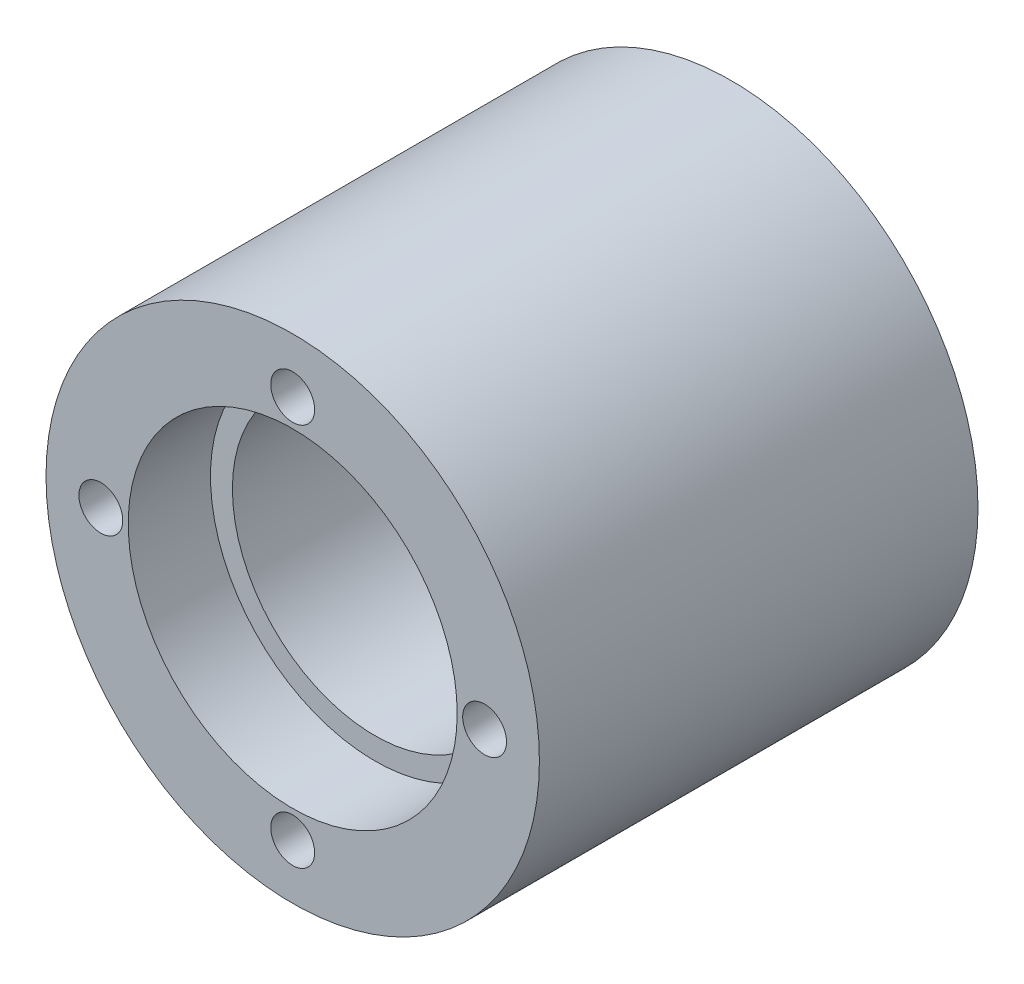
ISO-10303-21;
HEADER;
FILE_DESCRIPTION(('STEP AP214'),'2;1');
FILE_NAME('part.step','',(''),(''),'','','');
FILE_SCHEMA(('AUTOMOTIVE_DESIGN { 1 0 10303 214 1 1 1 1 }'));
ENDSEC;
DATA;
#1=APPLICATION_CONTEXT('core data for automotive mechanical design processes');
#2=APPLICATION_PROTOCOL_DEFINITION('international standard','automotive_design',2000,#1);
#3=PRODUCT_CONTEXT('',#1,'mechanical');
#4=PRODUCT('Part','Part','',(#3));
#5=PRODUCT_RELATED_PRODUCT_CATEGORY('part','',(#4));
#6=PRODUCT_DEFINITION_FORMATION('','',#4);
#7=PRODUCT_DEFINITION_CONTEXT('part definition',#1,'design');
#8=PRODUCT_DEFINITION('design','',#6,#7);
#9=PRODUCT_DEFINITION_SHAPE('','',#8);
#10=(LENGTH_UNIT() NAMED_UNIT(*) SI_UNIT(.MILLI.,.METRE.));
#11=(NAMED_UNIT(*) PLANE_ANGLE_UNIT() SI_UNIT($,.RADIAN.));
#12=(NAMED_UNIT(*) SI_UNIT($,.STERADIAN.) SOLID_ANGLE_UNIT());
#13=UNCERTAINTY_MEASURE_WITH_UNIT(LENGTH_MEASURE(1.E-05),#10,'distance_accuracy_value','');
#14=(GEOMETRIC_REPRESENTATION_CONTEXT(3) GLOBAL_UNCERTAINTY_ASSIGNED_CONTEXT((#13)) GLOBAL_UNIT_ASSIGNED_CONTEXT((#10,
#11,#12)) REPRESENTATION_CONTEXT('',''));
#15=CARTESIAN_POINT('',(0.,0.,0.));
#16=DIRECTION('',(0.,0.,1.));
#17=DIRECTION('',(1.,0.,0.));
#18=AXIS2_PLACEMENT_3D('',#15,#16,#17);
#19=CARTESIAN_POINT('',(0.,0.,-20.));
#20=DIRECTION('',(0.,0.,1.));
#21=DIRECTION('',(-1.,0.,0.));
#22=AXIS2_PLACEMENT_3D('',#19,#20,#21);
#23=CYLINDRICAL_SURFACE('',#22,15.);
#24=CARTESIAN_POINT('',(0.,0.,20.));
#25=DIRECTION('',(0.,0.,1.));
#26=DIRECTION('',(1.,0.,0.));
#27=AXIS2_PLACEMENT_3D('',#24,#25,#26);
#28=CIRCLE('',#27,15.);
#29=CARTESIAN_POINT('',(15.,0.,20.));
#30=VERTEX_POINT('',#29);
#31=EDGE_CURVE('E61',#30,#30,#28,.T.);
#32=ORIENTED_EDGE('',*,*,#31,.T.);
#33=EDGE_LOOP('',(#32));
#34=FACE_BOUND('',#33,.T.);
#35=CARTESIAN_POINT('',(0.,0.,12.5));
#36=DIRECTION('',(0.,0.,1.));
#37=DIRECTION('',(1.,0.,0.));
#38=AXIS2_PLACEMENT_3D('',#35,#36,#37);
#39=CIRCLE('',#38,15.);
#40=CARTESIAN_POINT('',(15.,0.,12.5));
#41=VERTEX_POINT('',#40);
#42=EDGE_CURVE('E88',#41,#41,#39,.T.);
#43=ORIENTED_EDGE('',*,*,#42,.F.);
#44=EDGE_LOOP('',(#43));
#45=FACE_BOUND('',#44,.T.);
#46=ADVANCED_FACE('F43',(#34,#45),#23,.F.);
#47=CARTESIAN_POINT('',(0.,0.,-20.));
#48=DIRECTION('',(0.,0.,-1.));
#49=DIRECTION('',(1.,0.,0.));
#50=AXIS2_PLACEMENT_3D('',#47,#48,#49);
#51=PLANE('',#50);
#52=CARTESIAN_POINT('',(0.,-17.5,-20.));
#53=DIRECTION('',(0.,0.,1.));
#54=DIRECTION('',(1.,0.,0.));
#55=AXIS2_PLACEMENT_3D('',#52,#53,#54);
#56=CIRCLE('',#55,2.);
#57=CARTESIAN_POINT('',(2.,-17.5,-20.));
#58=VERTEX_POINT('',#57);
#59=EDGE_CURVE('E76',#58,#58,#56,.T.);
#60=ORIENTED_EDGE('',*,*,#59,.T.);
#61=EDGE_LOOP('',(#60));
#62=FACE_BOUND('',#61,.T.);
#63=CARTESIAN_POINT('',(0.,17.5,-20.));
#64=DIRECTION('',(0.,0.,1.));
#65=DIRECTION('',(1.,0.,0.));
#66=AXIS2_PLACEMENT_3D('',#63,#64,#65);
#67=CIRCLE('',#66,2.);
#68=CARTESIAN_POINT('',(2.,17.5,-20.));
#69=VERTEX_POINT('',#68);
#70=EDGE_CURVE('E64',#69,#69,#67,.T.);
#71=ORIENTED_EDGE('',*,*,#70,.T.);
#72=EDGE_LOOP('',(#71));
#73=FACE_BOUND('',#72,.T.);
#74=CARTESIAN_POINT('',(0.,0.,-20.));
#75=DIRECTION('',(0.,0.,1.));
#76=DIRECTION('',(1.,0.,0.));
#77=AXIS2_PLACEMENT_3D('',#74,#75,#76);
#78=CIRCLE('',#77,22.5);
#79=CARTESIAN_POINT('',(22.5,0.,-20.));
#80=VERTEX_POINT('',#79);
#81=EDGE_CURVE('E50',#80,#80,#78,.T.);
#82=ORIENTED_EDGE('',*,*,#81,.F.);
#83=EDGE_LOOP('',(#82));
#84=FACE_BOUND('',#83,.T.);
#85=CARTESIAN_POINT('',(0.,0.,-20.));
#86=DIRECTION('',(0.,0.,1.));
#87=DIRECTION('',(1.,0.,0.));
#88=AXIS2_PLACEMENT_3D('',#85,#86,#87);
#89=CIRCLE('',#88,15.);
#90=CARTESIAN_POINT('',(15.,0.,-20.));
#91=VERTEX_POINT('',#90);
#92=EDGE_CURVE('E59',#91,#91,#89,.T.);
#93=ORIENTED_EDGE('',*,*,#92,.T.);
#94=EDGE_LOOP('',(#93));
#95=FACE_BOUND('',#94,.T.);
#96=CARTESIAN_POINT('',(17.5,0.,-20.));
#97=DIRECTION('',(0.,0.,1.));
#98=DIRECTION('',(1.,0.,0.));
#99=AXIS2_PLACEMENT_3D('',#96,#97,#98);
#100=CIRCLE('',#99,2.);
#101=CARTESIAN_POINT('',(19.5,0.,-20.));
#102=VERTEX_POINT('',#101);
#103=EDGE_CURVE('E70',#102,#102,#100,.T.);
#104=ORIENTED_EDGE('',*,*,#103,.T.);
#105=EDGE_LOOP('',(#104));
#106=FACE_BOUND('',#105,.T.);
#107=CARTESIAN_POINT('',(-17.5,0.,-20.));
#108=DIRECTION('',(0.,0.,1.));
#109=DIRECTION('',(1.,0.,0.));
#110=AXIS2_PLACEMENT_3D('',#107,#108,#109);
#111=CIRCLE('',#110,2.);
#112=CARTESIAN_POINT('',(-15.5,0.,-20.));
#113=VERTEX_POINT('',#112);
#114=EDGE_CURVE('E82',#113,#113,#111,.T.);
#115=ORIENTED_EDGE('',*,*,#114,.T.);
#116=EDGE_LOOP('',(#115));
#117=FACE_BOUND('',#116,.T.);
#118=ADVANCED_FACE('F120',(#62,#73,#84,#95,#106,#117),#51,.T.);
#119=CARTESIAN_POINT('',(0.,0.,20.));
#120=DIRECTION('',(0.,0.,-1.));
#121=DIRECTION('',(1.,0.,0.));
#122=AXIS2_PLACEMENT_3D('',#119,#120,#121);
#123=PLANE('',#122);
#124=CARTESIAN_POINT('',(0.,0.,20.));
#125=DIRECTION('',(0.,0.,1.));
#126=DIRECTION('',(1.,0.,0.));
#127=AXIS2_PLACEMENT_3D('',#124,#125,#126);
#128=CIRCLE('',#127,22.5);
#129=CARTESIAN_POINT('',(22.5,0.,20.));
#130=VERTEX_POINT('',#129);
#131=EDGE_CURVE('E54',#130,#130,#128,.T.);
#132=ORIENTED_EDGE('',*,*,#131,.T.);
#133=EDGE_LOOP('',(#132));
#134=FACE_BOUND('',#133,.T.);
#135=ORIENTED_EDGE('',*,*,#31,.F.);
#136=EDGE_LOOP('',(#135));
#137=FACE_BOUND('',#136,.T.);
#138=CARTESIAN_POINT('',(0.,17.5,20.));
#139=DIRECTION('',(0.,0.,1.));
#140=DIRECTION('',(1.,0.,0.));
#141=AXIS2_PLACEMENT_3D('',#138,#139,#140);
#142=CIRCLE('',#141,2.);
#143=CARTESIAN_POINT('',(2.,17.5,20.));
#144=VERTEX_POINT('',#143);
#145=EDGE_CURVE('E67',#144,#144,#142,.T.);
#146=ORIENTED_EDGE('',*,*,#145,.F.);
#147=EDGE_LOOP('',(#146));
#148=FACE_BOUND('',#147,.T.);
#149=CARTESIAN_POINT('',(17.5,0.,20.));
#150=DIRECTION('',(0.,0.,1.));
#151=DIRECTION('',(1.,0.,0.));
#152=AXIS2_PLACEMENT_3D('',#149,#150,#151);
#153=CIRCLE('',#152,2.);
#154=CARTESIAN_POINT('',(19.5,0.,20.));
#155=VERTEX_POINT('',#154);
#156=EDGE_CURVE('E73',#155,#155,#153,.T.);
#157=ORIENTED_EDGE('',*,*,#156,.F.);
#158=EDGE_LOOP('',(#157));
#159=FACE_BOUND('',#158,.T.);
#160=CARTESIAN_POINT('',(0.,-17.5,20.));
#161=DIRECTION('',(0.,0.,1.));
#162=DIRECTION('',(1.,0.,0.));
#163=AXIS2_PLACEMENT_3D('',#160,#161,#162);
#164=CIRCLE('',#163,2.);
#165=CARTESIAN_POINT('',(2.,-17.5,20.));
#166=VERTEX_POINT('',#165);
#167=EDGE_CURVE('E79',#166,#166,#164,.T.);
#168=ORIENTED_EDGE('',*,*,#167,.F.);
#169=EDGE_LOOP('',(#168));
#170=FACE_BOUND('',#169,.T.);
#171=CARTESIAN_POINT('',(-17.5,0.,20.));
#172=DIRECTION('',(0.,0.,1.));
#173=DIRECTION('',(1.,0.,0.));
#174=AXIS2_PLACEMENT_3D('',#171,#172,#173);
#175=CIRCLE('',#174,2.);
#176=CARTESIAN_POINT('',(-15.5,0.,20.));
#177=VERTEX_POINT('',#176);
#178=EDGE_CURVE('E85',#177,#177,#175,.T.);
#179=ORIENTED_EDGE('',*,*,#178,.F.);
#180=EDGE_LOOP('',(#179));
#181=FACE_BOUND('',#180,.T.);
#182=ADVANCED_FACE('F127',(#134,#137,#148,#159,#170,#181),#123,.F.);
#183=CARTESIAN_POINT('',(0.,0.,-20.));
#184=DIRECTION('',(0.,0.,1.));
#185=DIRECTION('',(-1.,0.,0.));
#186=AXIS2_PLACEMENT_3D('',#183,#184,#185);
#187=CYLINDRICAL_SURFACE('',#186,22.5);
#188=ORIENTED_EDGE('',*,*,#81,.T.);
#189=EDGE_LOOP('',(#188));
#190=FACE_BOUND('',#189,.T.);
#191=ORIENTED_EDGE('',*,*,#131,.F.);
#192=EDGE_LOOP('',(#191));
#193=FACE_BOUND('',#192,.T.);
#194=ADVANCED_FACE('F45',(#190,#193),#187,.T.);
#195=CARTESIAN_POINT('',(0.,0.,-12.5));
#196=DIRECTION('',(0.,0.,1.));
#197=DIRECTION('',(1.,0.,0.));
#198=AXIS2_PLACEMENT_3D('',#195,#196,#197);
#199=CIRCLE('',#198,15.);
#200=CARTESIAN_POINT('',(15.,0.,-12.5));
#201=VERTEX_POINT('',#200);
#202=EDGE_CURVE('E10',#201,#201,#199,.T.);
#203=ORIENTED_EDGE('',*,*,#202,.T.);
#204=EDGE_LOOP('',(#203));
#205=FACE_BOUND('',#204,.T.);
#206=ORIENTED_EDGE('',*,*,#92,.F.);
#207=EDGE_LOOP('',(#206));
#208=FACE_BOUND('',#207,.T.);
#209=ADVANCED_FACE('F123',(#205,#208),#23,.F.);
#210=CARTESIAN_POINT('',(0.,17.5,-20.));
#211=DIRECTION('',(0.,0.,1.));
#212=DIRECTION('',(-1.,0.,0.));
#213=AXIS2_PLACEMENT_3D('',#210,#211,#212);
#214=CYLINDRICAL_SURFACE('',#213,2.);
#215=ORIENTED_EDGE('',*,*,#70,.F.);
#216=EDGE_LOOP('',(#215));
#217=FACE_BOUND('',#216,.T.);
#218=ORIENTED_EDGE('',*,*,#145,.T.);
#219=EDGE_LOOP('',(#218));
#220=FACE_BOUND('',#219,.T.);
#221=ADVANCED_FACE('F133',(#217,#220),#214,.F.);
#222=CARTESIAN_POINT('',(17.5,0.,-20.));
#223=DIRECTION('',(0.,0.,1.));
#224=DIRECTION('',(-1.,0.,0.));
#225=AXIS2_PLACEMENT_3D('',#222,#223,#224);
#226=CYLINDRICAL_SURFACE('',#225,2.);
#227=ORIENTED_EDGE('',*,*,#103,.F.);
#228=EDGE_LOOP('',(#227));
#229=FACE_BOUND('',#228,.T.);
#230=ORIENTED_EDGE('',*,*,#156,.T.);
#231=EDGE_LOOP('',(#230));
#232=FACE_BOUND('',#231,.T.);
#233=ADVANCED_FACE('F138',(#229,#232),#226,.F.);
#234=CARTESIAN_POINT('',(0.,-17.5,-20.));
#235=DIRECTION('',(0.,0.,1.));
#236=DIRECTION('',(-1.,0.,0.));
#237=AXIS2_PLACEMENT_3D('',#234,#235,#236);
#238=CYLINDRICAL_SURFACE('',#237,2.);
#239=ORIENTED_EDGE('',*,*,#59,.F.);
#240=EDGE_LOOP('',(#239));
#241=FACE_BOUND('',#240,.T.);
#242=ORIENTED_EDGE('',*,*,#167,.T.);
#243=EDGE_LOOP('',(#242));
#244=FACE_BOUND('',#243,.T.);
#245=ADVANCED_FACE('F150',(#241,#244),#238,.F.);
#246=CARTESIAN_POINT('',(-17.5,0.,-20.));
#247=DIRECTION('',(0.,0.,1.));
#248=DIRECTION('',(-1.,0.,0.));
#249=AXIS2_PLACEMENT_3D('',#246,#247,#248);
#250=CYLINDRICAL_SURFACE('',#249,2.);
#251=ORIENTED_EDGE('',*,*,#114,.F.);
#252=EDGE_LOOP('',(#251));
#253=FACE_BOUND('',#252,.T.);
#254=ORIENTED_EDGE('',*,*,#178,.T.);
#255=EDGE_LOOP('',(#254));
#256=FACE_BOUND('',#255,.T.);
#257=ADVANCED_FACE('F115',(#253,#256),#250,.F.);
#258=CARTESIAN_POINT('',(0.,0.,-12.5));
#259=DIRECTION('',(0.,0.,-1.));
#260=DIRECTION('',(1.,0.,0.));
#261=AXIS2_PLACEMENT_3D('',#258,#259,#260);
#262=PLANE('',#261);
#263=ORIENTED_EDGE('',*,*,#202,.F.);
#264=EDGE_LOOP('',(#263));
#265=FACE_BOUND('',#264,.T.);
#266=CARTESIAN_POINT('',(0.,0.,-12.5));
#267=DIRECTION('',(0.,0.,1.));
#268=DIRECTION('',(1.,0.,0.));
#269=AXIS2_PLACEMENT_3D('',#266,#267,#268);
#270=CIRCLE('',#269,13.);
#271=CARTESIAN_POINT('',(13.,0.,-12.5));
#272=VERTEX_POINT('',#271);
#273=EDGE_CURVE('E93',#272,#272,#270,.T.);
#274=ORIENTED_EDGE('',*,*,#273,.T.);
#275=EDGE_LOOP('',(#274));
#276=FACE_BOUND('',#275,.T.);
#277=ADVANCED_FACE('F100',(#265,#276),#262,.T.);
#278=CARTESIAN_POINT('',(0.,0.,12.5));
#279=DIRECTION('',(0.,0.,-1.));
#280=DIRECTION('',(1.,0.,0.));
#281=AXIS2_PLACEMENT_3D('',#278,#279,#280);
#282=PLANE('',#281);
#283=ORIENTED_EDGE('',*,*,#42,.T.);
#284=EDGE_LOOP('',(#283));
#285=FACE_BOUND('',#284,.T.);
#286=CARTESIAN_POINT('',(0.,0.,12.5));
#287=DIRECTION('',(0.,0.,1.));
#288=DIRECTION('',(1.,0.,0.));
#289=AXIS2_PLACEMENT_3D('',#286,#287,#288);
#290=CIRCLE('',#289,13.);
#291=CARTESIAN_POINT('',(13.,0.,12.5));
#292=VERTEX_POINT('',#291);
#293=EDGE_CURVE('E94',#292,#292,#290,.T.);
#294=ORIENTED_EDGE('',*,*,#293,.F.);
#295=EDGE_LOOP('',(#294));
#296=FACE_BOUND('',#295,.T.);
#297=ADVANCED_FACE('F105',(#285,#296),#282,.F.);
#298=CARTESIAN_POINT('',(0.,0.,-12.5));
#299=DIRECTION('',(0.,0.,1.));
#300=DIRECTION('',(-1.,0.,0.));
#301=AXIS2_PLACEMENT_3D('',#298,#299,#300);
#302=CYLINDRICAL_SURFACE('',#301,13.);
#303=ORIENTED_EDGE('',*,*,#273,.F.);
#304=EDGE_LOOP('',(#303));
#305=FACE_BOUND('',#304,.T.);
#306=ORIENTED_EDGE('',*,*,#293,.T.);
#307=EDGE_LOOP('',(#306));
#308=FACE_BOUND('',#307,.T.);
#309=ADVANCED_FACE('F102',(#305,#308),#302,.F.);
#310=CLOSED_SHELL('',(#46,#118,#182,#194,#209,#221,#233,#245,#257,#277,#297,#309));
#311=MANIFOLD_SOLID_BREP('B2',#310);
#312=ADVANCED_BREP_SHAPE_REPRESENTATION('',(#18,#311),#14);
#313=SHAPE_DEFINITION_REPRESENTATION(#9,#312);
ENDSEC;
END-ISO-10303-21;
